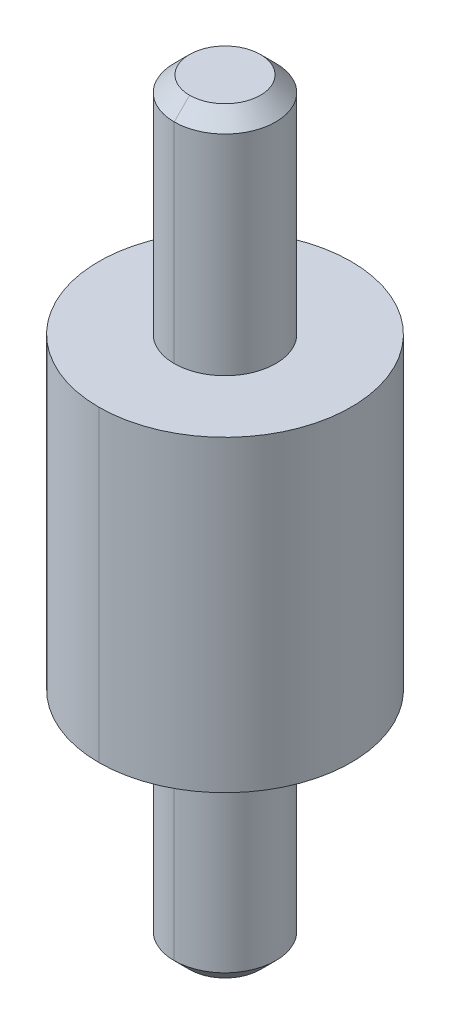
ISO-10303-21;
HEADER;
FILE_DESCRIPTION(('STEP AP214'),'2;1');
FILE_NAME('part.step','',(''),(''),'','','');
FILE_SCHEMA(('AUTOMOTIVE_DESIGN { 1 0 10303 214 1 1 1 1 }'));
ENDSEC;
DATA;
#1=APPLICATION_CONTEXT('core data for automotive mechanical design processes');
#2=APPLICATION_PROTOCOL_DEFINITION('international standard','automotive_design',2000,#1);
#3=PRODUCT_CONTEXT('',#1,'mechanical');
#4=PRODUCT('Part','Part','',(#3));
#5=PRODUCT_RELATED_PRODUCT_CATEGORY('part','',(#4));
#6=PRODUCT_DEFINITION_FORMATION('','',#4);
#7=PRODUCT_DEFINITION_CONTEXT('part definition',#1,'design');
#8=PRODUCT_DEFINITION('design','',#6,#7);
#9=PRODUCT_DEFINITION_SHAPE('','',#8);
#10=(LENGTH_UNIT() NAMED_UNIT(*) SI_UNIT(.MILLI.,.METRE.));
#11=(NAMED_UNIT(*) PLANE_ANGLE_UNIT() SI_UNIT($,.RADIAN.));
#12=(NAMED_UNIT(*) SI_UNIT($,.STERADIAN.) SOLID_ANGLE_UNIT());
#13=UNCERTAINTY_MEASURE_WITH_UNIT(LENGTH_MEASURE(1.E-05),#10,'distance_accuracy_value','');
#14=(GEOMETRIC_REPRESENTATION_CONTEXT(3) GLOBAL_UNCERTAINTY_ASSIGNED_CONTEXT((#13)) GLOBAL_UNIT_ASSIGNED_CONTEXT((#10,
#11,#12)) REPRESENTATION_CONTEXT('',''));
#15=CARTESIAN_POINT('',(0.,0.,0.));
#16=DIRECTION('',(0.,0.,1.));
#17=DIRECTION('',(1.,0.,0.));
#18=AXIS2_PLACEMENT_3D('',#15,#16,#17);
#19=CARTESIAN_POINT('',(0.,15.621,0.));
#20=DIRECTION('',(0.,-1.,0.));
#21=DIRECTION('',(0.,0.,-1.));
#22=AXIS2_PLACEMENT_3D('',#19,#20,#21);
#23=CYLINDRICAL_SURFACE('',#22,2.0955);
#24=DIRECTION('',(0.,-1.,0.));
#25=VECTOR('',#24,1.);
#26=CARTESIAN_POINT('',(0.,15.621,2.0955));
#27=LINE('',#26,#25);
#28=CARTESIAN_POINT('',(0.,14.986,2.0955));
#29=VERTEX_POINT('',#28);
#30=CARTESIAN_POINT('',(0.,6.35,2.0955));
#31=VERTEX_POINT('',#30);
#32=EDGE_CURVE('E41',#29,#31,#27,.T.);
#33=ORIENTED_EDGE('',*,*,#32,.F.);
#34=CARTESIAN_POINT('',(0.,14.986,0.));
#35=DIRECTION('',(0.,-1.,0.));
#36=DIRECTION('',(0.,0.,1.));
#37=AXIS2_PLACEMENT_3D('',#34,#35,#36);
#38=CIRCLE('',#37,2.0955);
#39=CARTESIAN_POINT('',(0.,14.986,-2.0955));
#40=VERTEX_POINT('',#39);
#41=EDGE_CURVE('E10',#29,#40,#38,.T.);
#42=ORIENTED_EDGE('',*,*,#41,.T.);
#43=DIRECTION('',(0.,-1.,0.));
#44=VECTOR('',#43,1.);
#45=CARTESIAN_POINT('',(0.,15.621,-2.0955));
#46=LINE('',#45,#44);
#47=CARTESIAN_POINT('',(0.,6.35,-2.0955));
#48=VERTEX_POINT('',#47);
#49=EDGE_CURVE('E30',#40,#48,#46,.T.);
#50=ORIENTED_EDGE('',*,*,#49,.T.);
#51=CARTESIAN_POINT('',(0.,6.35,0.));
#52=DIRECTION('',(0.,-1.,0.));
#53=DIRECTION('',(0.,0.,1.));
#54=AXIS2_PLACEMENT_3D('',#51,#52,#53);
#55=CIRCLE('',#54,2.0955);
#56=EDGE_CURVE('E102',#31,#48,#55,.T.);
#57=ORIENTED_EDGE('',*,*,#56,.F.);
#58=EDGE_LOOP('',(#33,#42,#50,#57));
#59=FACE_BOUND('',#58,.T.);
#60=ADVANCED_FACE('F16',(#59),#23,.T.);
#61=CARTESIAN_POINT('',(0.,15.621,0.));
#62=DIRECTION('',(0.,-1.,0.));
#63=DIRECTION('',(0.,0.,-1.));
#64=AXIS2_PLACEMENT_3D('',#61,#62,#63);
#65=CYLINDRICAL_SURFACE('',#64,2.0955);
#66=CARTESIAN_POINT('',(0.,14.986,0.));
#67=DIRECTION('',(0.,-1.,0.));
#68=DIRECTION('',(0.,0.,1.));
#69=AXIS2_PLACEMENT_3D('',#66,#67,#68);
#70=CIRCLE('',#69,2.0955);
#71=EDGE_CURVE('E114',#40,#29,#70,.T.);
#72=ORIENTED_EDGE('',*,*,#71,.T.);
#73=ORIENTED_EDGE('',*,*,#32,.T.);
#74=CARTESIAN_POINT('',(0.,6.35,0.));
#75=DIRECTION('',(0.,-1.,0.));
#76=DIRECTION('',(0.,0.,1.));
#77=AXIS2_PLACEMENT_3D('',#74,#75,#76);
#78=CIRCLE('',#77,2.0955);
#79=EDGE_CURVE('E109',#48,#31,#78,.T.);
#80=ORIENTED_EDGE('',*,*,#79,.F.);
#81=ORIENTED_EDGE('',*,*,#49,.F.);
#82=EDGE_LOOP('',(#72,#73,#80,#81));
#83=FACE_BOUND('',#82,.T.);
#84=ADVANCED_FACE('F18',(#83),#65,.T.);
#85=CARTESIAN_POINT('',(0.,6.35,0.));
#86=DIRECTION('',(0.,1.,0.));
#87=DIRECTION('',(1.,0.,0.));
#88=AXIS2_PLACEMENT_3D('',#85,#86,#87);
#89=PLANE('',#88);
#90=CARTESIAN_POINT('',(0.,6.35,0.));
#91=DIRECTION('',(0.,1.,0.));
#92=DIRECTION('',(0.,0.,1.));
#93=AXIS2_PLACEMENT_3D('',#90,#91,#92);
#94=CIRCLE('',#93,5.207);
#95=CARTESIAN_POINT('',(0.,6.35,-5.207));
#96=VERTEX_POINT('',#95);
#97=CARTESIAN_POINT('',(0.,6.35,5.207));
#98=VERTEX_POINT('',#97);
#99=EDGE_CURVE('E116',#96,#98,#94,.T.);
#100=ORIENTED_EDGE('',*,*,#99,.T.);
#101=CARTESIAN_POINT('',(0.,6.35,0.));
#102=DIRECTION('',(0.,1.,0.));
#103=DIRECTION('',(0.,0.,1.));
#104=AXIS2_PLACEMENT_3D('',#101,#102,#103);
#105=CIRCLE('',#104,5.207);
#106=EDGE_CURVE('E98',#98,#96,#105,.T.);
#107=ORIENTED_EDGE('',*,*,#106,.T.);
#108=EDGE_LOOP('',(#100,#107));
#109=FACE_BOUND('',#108,.T.);
#110=ORIENTED_EDGE('',*,*,#79,.T.);
#111=ORIENTED_EDGE('',*,*,#56,.T.);
#112=EDGE_LOOP('',(#110,#111));
#113=FACE_BOUND('',#112,.T.);
#114=ADVANCED_FACE('F119',(#109,#113),#89,.T.);
#115=CARTESIAN_POINT('',(0.,15.621,0.));
#116=DIRECTION('',(0.,-1.,0.));
#117=DIRECTION('',(0.,0.,-1.));
#118=AXIS2_PLACEMENT_3D('',#115,#116,#117);
#119=CONICAL_SURFACE('',#118,1.4605,0.785398163397452);
#120=DIRECTION('',(0.,-0.707106781186545,0.70710678118655));
#121=VECTOR('',#120,1.);
#122=CARTESIAN_POINT('',(0.,15.621,1.4605));
#123=LINE('',#122,#121);
#124=CARTESIAN_POINT('',(0.,15.621,1.4605));
#125=VERTEX_POINT('',#124);
#126=EDGE_CURVE('E146',#125,#29,#123,.T.);
#127=ORIENTED_EDGE('',*,*,#126,.F.);
#128=CARTESIAN_POINT('',(0.,15.621,0.));
#129=DIRECTION('',(0.,1.,0.));
#130=DIRECTION('',(0.,0.,1.));
#131=AXIS2_PLACEMENT_3D('',#128,#129,#130);
#132=CIRCLE('',#131,1.4605);
#133=CARTESIAN_POINT('',(0.,15.621,-1.4605));
#134=VERTEX_POINT('',#133);
#135=EDGE_CURVE('E134',#134,#125,#132,.T.);
#136=ORIENTED_EDGE('',*,*,#135,.F.);
#137=DIRECTION('',(0.,-0.707106781186545,-0.70710678118655));
#138=VECTOR('',#137,1.);
#139=CARTESIAN_POINT('',(0.,15.621,-1.4605));
#140=LINE('',#139,#138);
#141=EDGE_CURVE('E20',#134,#40,#140,.T.);
#142=ORIENTED_EDGE('',*,*,#141,.T.);
#143=ORIENTED_EDGE('',*,*,#41,.F.);
#144=EDGE_LOOP('',(#127,#136,#142,#143));
#145=FACE_BOUND('',#144,.T.);
#146=ADVANCED_FACE('F339',(#145),#119,.T.);
#147=CARTESIAN_POINT('',(0.,15.621,0.));
#148=DIRECTION('',(0.,-1.,0.));
#149=DIRECTION('',(0.,0.,-1.));
#150=AXIS2_PLACEMENT_3D('',#147,#148,#149);
#151=CONICAL_SURFACE('',#150,1.4605,0.785398163397452);
#152=CARTESIAN_POINT('',(0.,15.621,0.));
#153=DIRECTION('',(0.,1.,0.));
#154=DIRECTION('',(0.,0.,1.));
#155=AXIS2_PLACEMENT_3D('',#152,#153,#154);
#156=CIRCLE('',#155,1.4605);
#157=EDGE_CURVE('E138',#125,#134,#156,.T.);
#158=ORIENTED_EDGE('',*,*,#157,.F.);
#159=ORIENTED_EDGE('',*,*,#126,.T.);
#160=ORIENTED_EDGE('',*,*,#71,.F.);
#161=ORIENTED_EDGE('',*,*,#141,.F.);
#162=EDGE_LOOP('',(#158,#159,#160,#161));
#163=FACE_BOUND('',#162,.T.);
#164=ADVANCED_FACE('F309',(#163),#151,.T.);
#165=CARTESIAN_POINT('',(0.,6.35,0.));
#166=DIRECTION('',(0.,-1.,0.));
#167=DIRECTION('',(0.,0.,-1.));
#168=AXIS2_PLACEMENT_3D('',#165,#166,#167);
#169=CYLINDRICAL_SURFACE('',#168,5.207);
#170=ORIENTED_EDGE('',*,*,#106,.F.);
#171=DIRECTION('',(0.,-1.,0.));
#172=VECTOR('',#171,1.);
#173=CARTESIAN_POINT('',(0.,6.35,5.207));
#174=LINE('',#173,#172);
#175=CARTESIAN_POINT('',(0.,-6.35,5.207));
#176=VERTEX_POINT('',#175);
#177=EDGE_CURVE('E144',#98,#176,#174,.T.);
#178=ORIENTED_EDGE('',*,*,#177,.T.);
#179=CARTESIAN_POINT('',(0.,-6.35,0.));
#180=DIRECTION('',(0.,1.,0.));
#181=DIRECTION('',(0.,0.,1.));
#182=AXIS2_PLACEMENT_3D('',#179,#180,#181);
#183=CIRCLE('',#182,5.207);
#184=CARTESIAN_POINT('',(0.,-6.35,-5.207));
#185=VERTEX_POINT('',#184);
#186=EDGE_CURVE('E132',#176,#185,#183,.T.);
#187=ORIENTED_EDGE('',*,*,#186,.T.);
#188=DIRECTION('',(0.,-1.,0.));
#189=VECTOR('',#188,1.);
#190=CARTESIAN_POINT('',(0.,6.35,-5.207));
#191=LINE('',#190,#189);
#192=EDGE_CURVE('E131',#96,#185,#191,.T.);
#193=ORIENTED_EDGE('',*,*,#192,.F.);
#194=EDGE_LOOP('',(#170,#178,#187,#193));
#195=FACE_BOUND('',#194,.T.);
#196=ADVANCED_FACE('F304',(#195),#169,.T.);
#197=CARTESIAN_POINT('',(0.,6.35,0.));
#198=DIRECTION('',(0.,-1.,0.));
#199=DIRECTION('',(0.,0.,-1.));
#200=AXIS2_PLACEMENT_3D('',#197,#198,#199);
#201=CYLINDRICAL_SURFACE('',#200,5.207);
#202=ORIENTED_EDGE('',*,*,#177,.F.);
#203=ORIENTED_EDGE('',*,*,#99,.F.);
#204=ORIENTED_EDGE('',*,*,#192,.T.);
#205=CARTESIAN_POINT('',(0.,-6.35,0.));
#206=DIRECTION('',(0.,1.,0.));
#207=DIRECTION('',(0.,0.,1.));
#208=AXIS2_PLACEMENT_3D('',#205,#206,#207);
#209=CIRCLE('',#208,5.207);
#210=EDGE_CURVE('E133',#185,#176,#209,.T.);
#211=ORIENTED_EDGE('',*,*,#210,.T.);
#212=EDGE_LOOP('',(#202,#203,#204,#211));
#213=FACE_BOUND('',#212,.T.);
#214=ADVANCED_FACE('F310',(#213),#201,.T.);
#215=CARTESIAN_POINT('',(0.,15.621,0.));
#216=DIRECTION('',(0.,1.,0.));
#217=DIRECTION('',(1.,0.,0.));
#218=AXIS2_PLACEMENT_3D('',#215,#216,#217);
#219=PLANE('',#218);
#220=ORIENTED_EDGE('',*,*,#135,.T.);
#221=ORIENTED_EDGE('',*,*,#157,.T.);
#222=EDGE_LOOP('',(#220,#221));
#223=FACE_BOUND('',#222,.T.);
#224=ADVANCED_FACE('F298',(#223),#219,.T.);
#225=CARTESIAN_POINT('',(0.,-6.35,0.));
#226=DIRECTION('',(0.,1.,0.));
#227=DIRECTION('',(1.,0.,0.));
#228=AXIS2_PLACEMENT_3D('',#225,#226,#227);
#229=PLANE('',#228);
#230=ORIENTED_EDGE('',*,*,#210,.F.);
#231=ORIENTED_EDGE('',*,*,#186,.F.);
#232=EDGE_LOOP('',(#230,#231));
#233=FACE_BOUND('',#232,.T.);
#234=CARTESIAN_POINT('',(0.,-6.35,0.));
#235=DIRECTION('',(0.,-1.,0.));
#236=DIRECTION('',(0.,0.,1.));
#237=AXIS2_PLACEMENT_3D('',#234,#235,#236);
#238=CIRCLE('',#237,2.0955);
#239=CARTESIAN_POINT('',(0.,-6.35,-2.0955));
#240=VERTEX_POINT('',#239);
#241=CARTESIAN_POINT('',(0.,-6.35,2.0955));
#242=VERTEX_POINT('',#241);
#243=EDGE_CURVE('E149',#240,#242,#238,.T.);
#244=ORIENTED_EDGE('',*,*,#243,.F.);
#245=CARTESIAN_POINT('',(0.,-6.35,0.));
#246=DIRECTION('',(0.,-1.,0.));
#247=DIRECTION('',(0.,0.,1.));
#248=AXIS2_PLACEMENT_3D('',#245,#246,#247);
#249=CIRCLE('',#248,2.0955);
#250=EDGE_CURVE('E160',#242,#240,#249,.T.);
#251=ORIENTED_EDGE('',*,*,#250,.F.);
#252=EDGE_LOOP('',(#244,#251));
#253=FACE_BOUND('',#252,.T.);
#254=ADVANCED_FACE('F294',(#233,#253),#229,.F.);
#255=CARTESIAN_POINT('',(0.,15.621,0.));
#256=DIRECTION('',(0.,-1.,0.));
#257=DIRECTION('',(0.,0.,-1.));
#258=AXIS2_PLACEMENT_3D('',#255,#256,#257);
#259=CYLINDRICAL_SURFACE('',#258,2.0955);
#260=ORIENTED_EDGE('',*,*,#243,.T.);
#261=DIRECTION('',(0.,-1.,0.));
#262=VECTOR('',#261,1.);
#263=CARTESIAN_POINT('',(0.,15.621,2.0955));
#264=LINE('',#263,#262);
#265=CARTESIAN_POINT('',(0.,-14.986,2.0955));
#266=VERTEX_POINT('',#265);
#267=EDGE_CURVE('E127',#242,#266,#264,.T.);
#268=ORIENTED_EDGE('',*,*,#267,.T.);
#269=CARTESIAN_POINT('',(0.,-14.986,0.));
#270=DIRECTION('',(0.,1.,0.));
#271=DIRECTION('',(0.,0.,1.));
#272=AXIS2_PLACEMENT_3D('',#269,#270,#271);
#273=CIRCLE('',#272,2.0955);
#274=CARTESIAN_POINT('',(0.,-14.986,-2.0955));
#275=VERTEX_POINT('',#274);
#276=EDGE_CURVE('E181',#266,#275,#273,.T.);
#277=ORIENTED_EDGE('',*,*,#276,.T.);
#278=DIRECTION('',(0.,-1.,0.));
#279=VECTOR('',#278,1.);
#280=CARTESIAN_POINT('',(0.,15.621,-2.0955));
#281=LINE('',#280,#279);
#282=EDGE_CURVE('E153',#240,#275,#281,.T.);
#283=ORIENTED_EDGE('',*,*,#282,.F.);
#284=EDGE_LOOP('',(#260,#268,#277,#283));
#285=FACE_BOUND('',#284,.T.);
#286=ADVANCED_FACE('F208',(#285),#259,.T.);
#287=CARTESIAN_POINT('',(0.,15.621,0.));
#288=DIRECTION('',(0.,-1.,0.));
#289=DIRECTION('',(0.,0.,-1.));
#290=AXIS2_PLACEMENT_3D('',#287,#288,#289);
#291=CYLINDRICAL_SURFACE('',#290,2.0955);
#292=ORIENTED_EDGE('',*,*,#267,.F.);
#293=ORIENTED_EDGE('',*,*,#250,.T.);
#294=ORIENTED_EDGE('',*,*,#282,.T.);
#295=CARTESIAN_POINT('',(0.,-14.986,0.));
#296=DIRECTION('',(0.,1.,0.));
#297=DIRECTION('',(0.,0.,1.));
#298=AXIS2_PLACEMENT_3D('',#295,#296,#297);
#299=CIRCLE('',#298,2.0955);
#300=EDGE_CURVE('E158',#275,#266,#299,.T.);
#301=ORIENTED_EDGE('',*,*,#300,.T.);
#302=EDGE_LOOP('',(#292,#293,#294,#301));
#303=FACE_BOUND('',#302,.T.);
#304=ADVANCED_FACE('F202',(#303),#291,.T.);
#305=CARTESIAN_POINT('',(0.,-14.986,0.));
#306=DIRECTION('',(0.,1.,0.));
#307=DIRECTION('',(0.,0.,1.));
#308=AXIS2_PLACEMENT_3D('',#305,#306,#307);
#309=CONICAL_SURFACE('',#308,2.0955,0.785398163397454);
#310=CARTESIAN_POINT('',(0.,-15.621,0.));
#311=DIRECTION('',(0.,-1.,0.));
#312=DIRECTION('',(0.,0.,1.));
#313=AXIS2_PLACEMENT_3D('',#310,#311,#312);
#314=CIRCLE('',#313,1.46049999999997);
#315=CARTESIAN_POINT('',(0.,-15.621,-1.46049999999997));
#316=VERTEX_POINT('',#315);
#317=CARTESIAN_POINT('',(0.,-15.621,1.46049999999997));
#318=VERTEX_POINT('',#317);
#319=EDGE_CURVE('E141',#316,#318,#314,.T.);
#320=ORIENTED_EDGE('',*,*,#319,.F.);
#321=DIRECTION('',(0.,0.707106781186544,-0.707106781186552));
#322=VECTOR('',#321,1.);
#323=CARTESIAN_POINT('',(0.,-14.986,-2.0955));
#324=LINE('',#323,#322);
#325=EDGE_CURVE('E165',#316,#275,#324,.T.);
#326=ORIENTED_EDGE('',*,*,#325,.T.);
#327=ORIENTED_EDGE('',*,*,#276,.F.);
#328=DIRECTION('',(0.,0.707106781186544,0.707106781186552));
#329=VECTOR('',#328,1.);
#330=CARTESIAN_POINT('',(0.,-14.986,2.0955));
#331=LINE('',#330,#329);
#332=EDGE_CURVE('E142',#318,#266,#331,.T.);
#333=ORIENTED_EDGE('',*,*,#332,.F.);
#334=EDGE_LOOP('',(#320,#326,#327,#333));
#335=FACE_BOUND('',#334,.T.);
#336=ADVANCED_FACE('F196',(#335),#309,.T.);
#337=CARTESIAN_POINT('',(0.,-14.986,0.));
#338=DIRECTION('',(0.,1.,0.));
#339=DIRECTION('',(0.,0.,1.));
#340=AXIS2_PLACEMENT_3D('',#337,#338,#339);
#341=CONICAL_SURFACE('',#340,2.0955,0.785398163397454);
#342=ORIENTED_EDGE('',*,*,#325,.F.);
#343=CARTESIAN_POINT('',(0.,-15.621,0.));
#344=DIRECTION('',(0.,-1.,0.));
#345=DIRECTION('',(0.,0.,1.));
#346=AXIS2_PLACEMENT_3D('',#343,#344,#345);
#347=CIRCLE('',#346,1.46049999999997);
#348=EDGE_CURVE('E137',#318,#316,#347,.T.);
#349=ORIENTED_EDGE('',*,*,#348,.F.);
#350=ORIENTED_EDGE('',*,*,#332,.T.);
#351=ORIENTED_EDGE('',*,*,#300,.F.);
#352=EDGE_LOOP('',(#342,#349,#350,#351));
#353=FACE_BOUND('',#352,.T.);
#354=ADVANCED_FACE('F205',(#353),#341,.T.);
#355=CARTESIAN_POINT('',(0.,-15.621,0.));
#356=DIRECTION('',(0.,1.,0.));
#357=DIRECTION('',(1.,0.,0.));
#358=AXIS2_PLACEMENT_3D('',#355,#356,#357);
#359=PLANE('',#358);
#360=ORIENTED_EDGE('',*,*,#348,.T.);
#361=ORIENTED_EDGE('',*,*,#319,.T.);
#362=EDGE_LOOP('',(#360,#361));
#363=FACE_BOUND('',#362,.T.);
#364=ADVANCED_FACE('F198',(#363),#359,.F.);
#365=CLOSED_SHELL('',(#60,#84,#114,#146,#164,#196,#214,#224,#254,#286,#304,#336,#354,#364));
#366=MANIFOLD_SOLID_BREP('B1',#365);
#367=ADVANCED_BREP_SHAPE_REPRESENTATION('',(#18,#366),#14);
#368=SHAPE_DEFINITION_REPRESENTATION(#9,#367);
ENDSEC;
END-ISO-10303-21;
